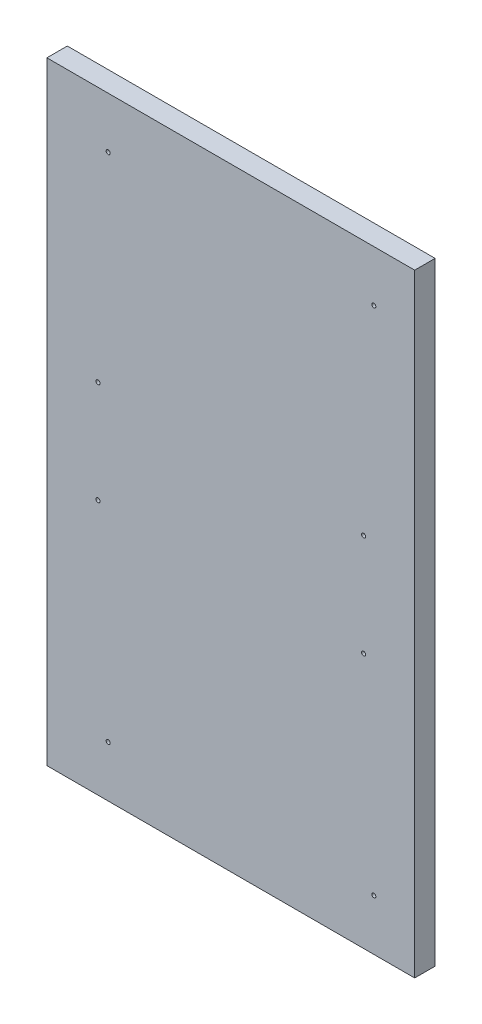
ISO-10303-21;
HEADER;
FILE_DESCRIPTION(('STEP AP214'),'2;1');
FILE_NAME('part.step','',(''),(''),'','','');
FILE_SCHEMA(('AUTOMOTIVE_DESIGN { 1 0 10303 214 1 1 1 1 }'));
ENDSEC;
DATA;
#1=APPLICATION_CONTEXT('core data for automotive mechanical design processes');
#2=APPLICATION_PROTOCOL_DEFINITION('international standard','automotive_design',2000,#1);
#3=PRODUCT_CONTEXT('',#1,'mechanical');
#4=PRODUCT('Part','Part','',(#3));
#5=PRODUCT_RELATED_PRODUCT_CATEGORY('part','',(#4));
#6=PRODUCT_DEFINITION_FORMATION('','',#4);
#7=PRODUCT_DEFINITION_CONTEXT('part definition',#1,'design');
#8=PRODUCT_DEFINITION('design','',#6,#7);
#9=PRODUCT_DEFINITION_SHAPE('','',#8);
#10=(LENGTH_UNIT() NAMED_UNIT(*) SI_UNIT(.MILLI.,.METRE.));
#11=(NAMED_UNIT(*) PLANE_ANGLE_UNIT() SI_UNIT($,.RADIAN.));
#12=(NAMED_UNIT(*) SI_UNIT($,.STERADIAN.) SOLID_ANGLE_UNIT());
#13=UNCERTAINTY_MEASURE_WITH_UNIT(LENGTH_MEASURE(1.E-05),#10,'distance_accuracy_value','');
#14=(GEOMETRIC_REPRESENTATION_CONTEXT(3) GLOBAL_UNCERTAINTY_ASSIGNED_CONTEXT((#13)) GLOBAL_UNIT_ASSIGNED_CONTEXT((#10,
#11,#12)) REPRESENTATION_CONTEXT('',''));
#15=CARTESIAN_POINT('',(0.,0.,0.));
#16=DIRECTION('',(0.,0.,1.));
#17=DIRECTION('',(1.,0.,0.));
#18=AXIS2_PLACEMENT_3D('',#15,#16,#17);
#19=CARTESIAN_POINT('',(90.,150.,10.));
#20=DIRECTION('',(-1.,0.,0.));
#21=DIRECTION('',(0.,-1.,0.));
#22=AXIS2_PLACEMENT_3D('',#19,#20,#21);
#23=PLANE('',#22);
#24=DIRECTION('',(0.,1.,0.));
#25=VECTOR('',#24,1.);
#26=CARTESIAN_POINT('',(90.,150.,0.));
#27=LINE('',#26,#25);
#28=CARTESIAN_POINT('',(90.,-150.,0.));
#29=VERTEX_POINT('',#28);
#30=CARTESIAN_POINT('',(90.,150.,0.));
#31=VERTEX_POINT('',#30);
#32=EDGE_CURVE('E280',#29,#31,#27,.T.);
#33=ORIENTED_EDGE('',*,*,#32,.T.);
#34=DIRECTION('',(0.,0.,-1.));
#35=VECTOR('',#34,1.);
#36=CARTESIAN_POINT('',(90.,150.,10.));
#37=LINE('',#36,#35);
#38=CARTESIAN_POINT('',(90.,150.,10.));
#39=VERTEX_POINT('',#38);
#40=EDGE_CURVE('E11',#39,#31,#37,.T.);
#41=ORIENTED_EDGE('',*,*,#40,.F.);
#42=DIRECTION('',(0.,1.,0.));
#43=VECTOR('',#42,1.);
#44=CARTESIAN_POINT('',(90.,150.,10.));
#45=LINE('',#44,#43);
#46=CARTESIAN_POINT('',(90.,-150.,10.));
#47=VERTEX_POINT('',#46);
#48=EDGE_CURVE('E281',#47,#39,#45,.T.);
#49=ORIENTED_EDGE('',*,*,#48,.F.);
#50=DIRECTION('',(0.,0.,-1.));
#51=VECTOR('',#50,1.);
#52=CARTESIAN_POINT('',(90.,-150.,10.));
#53=LINE('',#52,#51);
#54=EDGE_CURVE('E291',#47,#29,#53,.T.);
#55=ORIENTED_EDGE('',*,*,#54,.T.);
#56=EDGE_LOOP('',(#33,#41,#49,#55));
#57=FACE_BOUND('',#56,.T.);
#58=ADVANCED_FACE('F46',(#57),#23,.F.);
#59=CARTESIAN_POINT('',(-90.,150.,10.));
#60=DIRECTION('',(0.,-1.,0.));
#61=DIRECTION('',(0.,0.,-1.));
#62=AXIS2_PLACEMENT_3D('',#59,#60,#61);
#63=PLANE('',#62);
#64=DIRECTION('',(-1.,0.,0.));
#65=VECTOR('',#64,1.);
#66=CARTESIAN_POINT('',(-90.,150.,0.));
#67=LINE('',#66,#65);
#68=CARTESIAN_POINT('',(-90.,150.,0.));
#69=VERTEX_POINT('',#68);
#70=EDGE_CURVE('E295',#31,#69,#67,.T.);
#71=ORIENTED_EDGE('',*,*,#70,.T.);
#72=DIRECTION('',(0.,0.,-1.));
#73=VECTOR('',#72,1.);
#74=CARTESIAN_POINT('',(-90.,150.,10.));
#75=LINE('',#74,#73);
#76=CARTESIAN_POINT('',(-90.,150.,10.));
#77=VERTEX_POINT('',#76);
#78=EDGE_CURVE('E55',#77,#69,#75,.T.);
#79=ORIENTED_EDGE('',*,*,#78,.F.);
#80=DIRECTION('',(-1.,0.,0.));
#81=VECTOR('',#80,1.);
#82=CARTESIAN_POINT('',(-90.,150.,10.));
#83=LINE('',#82,#81);
#84=EDGE_CURVE('E94',#39,#77,#83,.T.);
#85=ORIENTED_EDGE('',*,*,#84,.F.);
#86=ORIENTED_EDGE('',*,*,#40,.T.);
#87=EDGE_LOOP('',(#71,#79,#85,#86));
#88=FACE_BOUND('',#87,.T.);
#89=ADVANCED_FACE('F325',(#88),#63,.F.);
#90=CARTESIAN_POINT('',(-90.,150.,10.));
#91=DIRECTION('',(1.,0.,0.));
#92=DIRECTION('',(0.,1.,0.));
#93=AXIS2_PLACEMENT_3D('',#90,#91,#92);
#94=PLANE('',#93);
#95=DIRECTION('',(0.,-1.,0.));
#96=VECTOR('',#95,1.);
#97=CARTESIAN_POINT('',(-90.,150.,0.));
#98=LINE('',#97,#96);
#99=CARTESIAN_POINT('',(-90.,-150.,0.));
#100=VERTEX_POINT('',#99);
#101=EDGE_CURVE('E81',#69,#100,#98,.T.);
#102=ORIENTED_EDGE('',*,*,#101,.T.);
#103=DIRECTION('',(0.,0.,-1.));
#104=VECTOR('',#103,1.);
#105=CARTESIAN_POINT('',(-90.,-150.,10.));
#106=LINE('',#105,#104);
#107=CARTESIAN_POINT('',(-90.,-150.,10.));
#108=VERTEX_POINT('',#107);
#109=EDGE_CURVE('E304',#108,#100,#106,.T.);
#110=ORIENTED_EDGE('',*,*,#109,.F.);
#111=DIRECTION('',(0.,-1.,0.));
#112=VECTOR('',#111,1.);
#113=CARTESIAN_POINT('',(-90.,150.,10.));
#114=LINE('',#113,#112);
#115=EDGE_CURVE('E286',#77,#108,#114,.T.);
#116=ORIENTED_EDGE('',*,*,#115,.F.);
#117=ORIENTED_EDGE('',*,*,#78,.T.);
#118=EDGE_LOOP('',(#102,#110,#116,#117));
#119=FACE_BOUND('',#118,.T.);
#120=ADVANCED_FACE('F308',(#119),#94,.F.);
#121=CARTESIAN_POINT('',(-90.,-150.,10.));
#122=DIRECTION('',(0.,1.,0.));
#123=DIRECTION('',(0.,0.,1.));
#124=AXIS2_PLACEMENT_3D('',#121,#122,#123);
#125=PLANE('',#124);
#126=DIRECTION('',(1.,0.,0.));
#127=VECTOR('',#126,1.);
#128=CARTESIAN_POINT('',(-90.,-150.,0.));
#129=LINE('',#128,#127);
#130=EDGE_CURVE('E87',#100,#29,#129,.T.);
#131=ORIENTED_EDGE('',*,*,#130,.T.);
#132=ORIENTED_EDGE('',*,*,#54,.F.);
#133=DIRECTION('',(1.,0.,0.));
#134=VECTOR('',#133,1.);
#135=CARTESIAN_POINT('',(-90.,-150.,10.));
#136=LINE('',#135,#134);
#137=EDGE_CURVE('E63',#108,#47,#136,.T.);
#138=ORIENTED_EDGE('',*,*,#137,.F.);
#139=ORIENTED_EDGE('',*,*,#109,.T.);
#140=EDGE_LOOP('',(#131,#132,#138,#139));
#141=FACE_BOUND('',#140,.T.);
#142=ADVANCED_FACE('F315',(#141),#125,.F.);
#143=CARTESIAN_POINT('',(0.,0.,10.));
#144=DIRECTION('',(0.,0.,1.));
#145=DIRECTION('',(1.,0.,0.));
#146=AXIS2_PLACEMENT_3D('',#143,#144,#145);
#147=PLANE('',#146);
#148=CARTESIAN_POINT('',(-65.,25.,10.));
#149=DIRECTION('',(0.,0.,1.));
#150=DIRECTION('',(1.,0.,0.));
#151=AXIS2_PLACEMENT_3D('',#148,#149,#150);
#152=CIRCLE('',#151,0.999999999999987);
#153=CARTESIAN_POINT('',(-64.,25.,10.));
#154=VERTEX_POINT('',#153);
#155=EDGE_CURVE('E184',#154,#154,#152,.T.);
#156=ORIENTED_EDGE('',*,*,#155,.F.);
#157=EDGE_LOOP('',(#156));
#158=FACE_BOUND('',#157,.T.);
#159=CARTESIAN_POINT('',(65.,25.,10.));
#160=DIRECTION('',(0.,0.,1.));
#161=DIRECTION('',(1.,0.,0.));
#162=AXIS2_PLACEMENT_3D('',#159,#160,#161);
#163=CIRCLE('',#162,0.999999999999987);
#164=CARTESIAN_POINT('',(66.,25.,10.));
#165=VERTEX_POINT('',#164);
#166=EDGE_CURVE('E192',#165,#165,#163,.T.);
#167=ORIENTED_EDGE('',*,*,#166,.F.);
#168=EDGE_LOOP('',(#167));
#169=FACE_BOUND('',#168,.T.);
#170=CARTESIAN_POINT('',(65.,-25.,10.));
#171=DIRECTION('',(0.,0.,1.));
#172=DIRECTION('',(1.,0.,0.));
#173=AXIS2_PLACEMENT_3D('',#170,#171,#172);
#174=CIRCLE('',#173,0.999999999999987);
#175=CARTESIAN_POINT('',(66.,-25.,10.));
#176=VERTEX_POINT('',#175);
#177=EDGE_CURVE('E200',#176,#176,#174,.T.);
#178=ORIENTED_EDGE('',*,*,#177,.F.);
#179=EDGE_LOOP('',(#178));
#180=FACE_BOUND('',#179,.T.);
#181=CARTESIAN_POINT('',(-65.,-25.,10.));
#182=DIRECTION('',(0.,0.,1.));
#183=DIRECTION('',(1.,0.,0.));
#184=AXIS2_PLACEMENT_3D('',#181,#182,#183);
#185=CIRCLE('',#184,0.999999999999987);
#186=CARTESIAN_POINT('',(-64.,-25.,10.));
#187=VERTEX_POINT('',#186);
#188=EDGE_CURVE('E208',#187,#187,#185,.T.);
#189=ORIENTED_EDGE('',*,*,#188,.F.);
#190=EDGE_LOOP('',(#189));
#191=FACE_BOUND('',#190,.T.);
#192=CARTESIAN_POINT('',(-60.,125.,10.));
#193=DIRECTION('',(0.,0.,1.));
#194=DIRECTION('',(1.,0.,0.));
#195=AXIS2_PLACEMENT_3D('',#192,#193,#194);
#196=CIRCLE('',#195,0.999999999999987);
#197=CARTESIAN_POINT('',(-59.,125.,10.));
#198=VERTEX_POINT('',#197);
#199=EDGE_CURVE('E216',#198,#198,#196,.T.);
#200=ORIENTED_EDGE('',*,*,#199,.F.);
#201=EDGE_LOOP('',(#200));
#202=FACE_BOUND('',#201,.T.);
#203=CARTESIAN_POINT('',(70.,125.,10.));
#204=DIRECTION('',(0.,0.,1.));
#205=DIRECTION('',(1.,0.,0.));
#206=AXIS2_PLACEMENT_3D('',#203,#204,#205);
#207=CIRCLE('',#206,0.999999999999987);
#208=CARTESIAN_POINT('',(71.,125.,10.));
#209=VERTEX_POINT('',#208);
#210=EDGE_CURVE('E224',#209,#209,#207,.T.);
#211=ORIENTED_EDGE('',*,*,#210,.F.);
#212=EDGE_LOOP('',(#211));
#213=FACE_BOUND('',#212,.T.);
#214=CARTESIAN_POINT('',(70.,-125.,10.));
#215=DIRECTION('',(0.,0.,1.));
#216=DIRECTION('',(1.,0.,0.));
#217=AXIS2_PLACEMENT_3D('',#214,#215,#216);
#218=CIRCLE('',#217,0.999999999999987);
#219=CARTESIAN_POINT('',(71.,-125.,10.));
#220=VERTEX_POINT('',#219);
#221=EDGE_CURVE('E232',#220,#220,#218,.T.);
#222=ORIENTED_EDGE('',*,*,#221,.F.);
#223=EDGE_LOOP('',(#222));
#224=FACE_BOUND('',#223,.T.);
#225=CARTESIAN_POINT('',(-60.,-125.,10.));
#226=DIRECTION('',(0.,0.,1.));
#227=DIRECTION('',(1.,0.,0.));
#228=AXIS2_PLACEMENT_3D('',#225,#226,#227);
#229=CIRCLE('',#228,0.999999999999987);
#230=CARTESIAN_POINT('',(-59.,-125.,10.));
#231=VERTEX_POINT('',#230);
#232=EDGE_CURVE('E240',#231,#231,#229,.T.);
#233=ORIENTED_EDGE('',*,*,#232,.F.);
#234=EDGE_LOOP('',(#233));
#235=FACE_BOUND('',#234,.T.);
#236=ORIENTED_EDGE('',*,*,#48,.T.);
#237=ORIENTED_EDGE('',*,*,#84,.T.);
#238=ORIENTED_EDGE('',*,*,#115,.T.);
#239=ORIENTED_EDGE('',*,*,#137,.T.);
#240=EDGE_LOOP('',(#236,#237,#238,#239));
#241=FACE_BOUND('',#240,.T.);
#242=ADVANCED_FACE('F317',(#158,#169,#180,#191,#202,#213,#224,#235,#241),#147,.T.);
#243=CARTESIAN_POINT('',(0.,0.,0.));
#244=DIRECTION('',(0.,0.,1.));
#245=DIRECTION('',(1.,0.,0.));
#246=AXIS2_PLACEMENT_3D('',#243,#244,#245);
#247=PLANE('',#246);
#248=CARTESIAN_POINT('',(0.,140.,0.));
#249=DIRECTION('',(0.,0.,-1.));
#250=DIRECTION('',(-1.,0.,0.));
#251=AXIS2_PLACEMENT_3D('',#248,#249,#250);
#252=CIRCLE('',#251,0.999999999999989);
#253=CARTESIAN_POINT('',(-0.999999999999989,140.,0.));
#254=VERTEX_POINT('',#253);
#255=EDGE_CURVE('E155',#254,#254,#252,.T.);
#256=ORIENTED_EDGE('',*,*,#255,.F.);
#257=EDGE_LOOP('',(#256));
#258=FACE_BOUND('',#257,.T.);
#259=CARTESIAN_POINT('',(0.,122.8,0.));
#260=DIRECTION('',(0.,0.,-1.));
#261=DIRECTION('',(-1.,0.,0.));
#262=AXIS2_PLACEMENT_3D('',#259,#260,#261);
#263=CIRCLE('',#262,0.999999999999989);
#264=CARTESIAN_POINT('',(-0.999999999999989,122.8,0.));
#265=VERTEX_POINT('',#264);
#266=EDGE_CURVE('E154',#265,#265,#263,.T.);
#267=ORIENTED_EDGE('',*,*,#266,.F.);
#268=EDGE_LOOP('',(#267));
#269=FACE_BOUND('',#268,.T.);
#270=CARTESIAN_POINT('',(0.,-122.8,0.));
#271=DIRECTION('',(0.,0.,-1.));
#272=DIRECTION('',(-1.,0.,0.));
#273=AXIS2_PLACEMENT_3D('',#270,#271,#272);
#274=CIRCLE('',#273,0.999999999999989);
#275=CARTESIAN_POINT('',(-0.999999999999989,-122.8,0.));
#276=VERTEX_POINT('',#275);
#277=EDGE_CURVE('E168',#276,#276,#274,.T.);
#278=ORIENTED_EDGE('',*,*,#277,.F.);
#279=EDGE_LOOP('',(#278));
#280=FACE_BOUND('',#279,.T.);
#281=CARTESIAN_POINT('',(0.,-140.,0.));
#282=DIRECTION('',(0.,0.,-1.));
#283=DIRECTION('',(-1.,0.,0.));
#284=AXIS2_PLACEMENT_3D('',#281,#282,#283);
#285=CIRCLE('',#284,0.999999999999989);
#286=CARTESIAN_POINT('',(-0.999999999999989,-140.,0.));
#287=VERTEX_POINT('',#286);
#288=EDGE_CURVE('E176',#287,#287,#285,.T.);
#289=ORIENTED_EDGE('',*,*,#288,.F.);
#290=EDGE_LOOP('',(#289));
#291=FACE_BOUND('',#290,.T.);
#292=CARTESIAN_POINT('',(50.,-110.,0.));
#293=DIRECTION('',(0.,0.,-1.));
#294=DIRECTION('',(-1.,0.,0.));
#295=AXIS2_PLACEMENT_3D('',#292,#293,#294);
#296=CIRCLE('',#295,0.999999999999987);
#297=CARTESIAN_POINT('',(49.,-110.,0.));
#298=VERTEX_POINT('',#297);
#299=EDGE_CURVE('E248',#298,#298,#296,.T.);
#300=ORIENTED_EDGE('',*,*,#299,.F.);
#301=EDGE_LOOP('',(#300));
#302=FACE_BOUND('',#301,.T.);
#303=CARTESIAN_POINT('',(49.9999999999999,110.,0.));
#304=DIRECTION('',(0.,0.,-1.));
#305=DIRECTION('',(-1.,0.,0.));
#306=AXIS2_PLACEMENT_3D('',#303,#304,#305);
#307=CIRCLE('',#306,0.999999999999987);
#308=CARTESIAN_POINT('',(48.9999999999999,110.,0.));
#309=VERTEX_POINT('',#308);
#310=EDGE_CURVE('E256',#309,#309,#307,.T.);
#311=ORIENTED_EDGE('',*,*,#310,.F.);
#312=EDGE_LOOP('',(#311));
#313=FACE_BOUND('',#312,.T.);
#314=CARTESIAN_POINT('',(-50.,110.,0.));
#315=DIRECTION('',(0.,0.,-1.));
#316=DIRECTION('',(-1.,0.,0.));
#317=AXIS2_PLACEMENT_3D('',#314,#315,#316);
#318=CIRCLE('',#317,0.999999999999987);
#319=CARTESIAN_POINT('',(-51.,110.,0.));
#320=VERTEX_POINT('',#319);
#321=EDGE_CURVE('E264',#320,#320,#318,.T.);
#322=ORIENTED_EDGE('',*,*,#321,.F.);
#323=EDGE_LOOP('',(#322));
#324=FACE_BOUND('',#323,.T.);
#325=CARTESIAN_POINT('',(-50.,-110.,0.));
#326=DIRECTION('',(0.,0.,-1.));
#327=DIRECTION('',(-1.,0.,0.));
#328=AXIS2_PLACEMENT_3D('',#325,#326,#327);
#329=CIRCLE('',#328,0.999999999999987);
#330=CARTESIAN_POINT('',(-51.,-110.,0.));
#331=VERTEX_POINT('',#330);
#332=EDGE_CURVE('E272',#331,#331,#329,.T.);
#333=ORIENTED_EDGE('',*,*,#332,.F.);
#334=EDGE_LOOP('',(#333));
#335=FACE_BOUND('',#334,.T.);
#336=ORIENTED_EDGE('',*,*,#32,.F.);
#337=ORIENTED_EDGE('',*,*,#130,.F.);
#338=ORIENTED_EDGE('',*,*,#101,.F.);
#339=ORIENTED_EDGE('',*,*,#70,.F.);
#340=EDGE_LOOP('',(#336,#337,#338,#339));
#341=FACE_BOUND('',#340,.T.);
#342=ADVANCED_FACE('F311',(#258,#269,#280,#291,#302,#313,#324,#335,#341),#247,.F.);
#343=CARTESIAN_POINT('',(-50.,-110.,6.39913938097244));
#344=DIRECTION('',(0.,0.,-1.));
#345=DIRECTION('',(-1.,0.,0.));
#346=AXIS2_PLACEMENT_3D('',#343,#344,#345);
#347=CONICAL_SURFACE('',#346,1.,1.02974425867665);
#348=CARTESIAN_POINT('',(-50.,-110.,7.));
#349=VERTEX_POINT('',#348);
#350=VERTEX_LOOP('',#349);
#351=FACE_BOUND('',#350,.T.);
#352=CARTESIAN_POINT('',(-50.,-110.,6.39913938097244));
#353=DIRECTION('',(0.,0.,-1.));
#354=DIRECTION('',(-1.,0.,0.));
#355=AXIS2_PLACEMENT_3D('',#352,#353,#354);
#356=CIRCLE('',#355,1.);
#357=CARTESIAN_POINT('',(-51.,-110.,6.39913938097244));
#358=VERTEX_POINT('',#357);
#359=EDGE_CURVE('E276',#358,#358,#356,.T.);
#360=ORIENTED_EDGE('',*,*,#359,.T.);
#361=EDGE_LOOP('',(#360));
#362=FACE_BOUND('',#361,.T.);
#363=ADVANCED_FACE('F350',(#351,#362),#347,.F.);
#364=CARTESIAN_POINT('',(-50.,-110.,0.));
#365=DIRECTION('',(0.,0.,-1.));
#366=DIRECTION('',(-1.,0.,0.));
#367=AXIS2_PLACEMENT_3D('',#364,#365,#366);
#368=CYLINDRICAL_SURFACE('',#367,0.999999999999994);
#369=ORIENTED_EDGE('',*,*,#359,.F.);
#370=EDGE_LOOP('',(#369));
#371=FACE_BOUND('',#370,.T.);
#372=ORIENTED_EDGE('',*,*,#332,.T.);
#373=EDGE_LOOP('',(#372));
#374=FACE_BOUND('',#373,.T.);
#375=ADVANCED_FACE('F355',(#371,#374),#368,.F.);
#376=CARTESIAN_POINT('',(-50.,110.,6.39913938097244));
#377=DIRECTION('',(0.,0.,-1.));
#378=DIRECTION('',(-1.,0.,0.));
#379=AXIS2_PLACEMENT_3D('',#376,#377,#378);
#380=CONICAL_SURFACE('',#379,1.,1.02974425867665);
#381=CARTESIAN_POINT('',(-50.,110.,7.));
#382=VERTEX_POINT('',#381);
#383=VERTEX_LOOP('',#382);
#384=FACE_BOUND('',#383,.T.);
#385=CARTESIAN_POINT('',(-50.,110.,6.39913938097244));
#386=DIRECTION('',(0.,0.,-1.));
#387=DIRECTION('',(-1.,0.,0.));
#388=AXIS2_PLACEMENT_3D('',#385,#386,#387);
#389=CIRCLE('',#388,1.);
#390=CARTESIAN_POINT('',(-51.,110.,6.39913938097244));
#391=VERTEX_POINT('',#390);
#392=EDGE_CURVE('E268',#391,#391,#389,.T.);
#393=ORIENTED_EDGE('',*,*,#392,.T.);
#394=EDGE_LOOP('',(#393));
#395=FACE_BOUND('',#394,.T.);
#396=ADVANCED_FACE('F368',(#384,#395),#380,.F.);
#397=CARTESIAN_POINT('',(-50.,110.,0.));
#398=DIRECTION('',(0.,0.,-1.));
#399=DIRECTION('',(-1.,0.,0.));
#400=AXIS2_PLACEMENT_3D('',#397,#398,#399);
#401=CYLINDRICAL_SURFACE('',#400,0.999999999999994);
#402=ORIENTED_EDGE('',*,*,#392,.F.);
#403=EDGE_LOOP('',(#402));
#404=FACE_BOUND('',#403,.T.);
#405=ORIENTED_EDGE('',*,*,#321,.T.);
#406=EDGE_LOOP('',(#405));
#407=FACE_BOUND('',#406,.T.);
#408=ADVANCED_FACE('F379',(#404,#407),#401,.F.);
#409=CARTESIAN_POINT('',(49.9999999999999,110.,6.39913938097244));
#410=DIRECTION('',(0.,0.,-1.));
#411=DIRECTION('',(-1.,0.,0.));
#412=AXIS2_PLACEMENT_3D('',#409,#410,#411);
#413=CONICAL_SURFACE('',#412,1.,1.02974425867665);
#414=CARTESIAN_POINT('',(49.9999999999999,110.,7.));
#415=VERTEX_POINT('',#414);
#416=VERTEX_LOOP('',#415);
#417=FACE_BOUND('',#416,.T.);
#418=CARTESIAN_POINT('',(49.9999999999999,110.,6.39913938097244));
#419=DIRECTION('',(0.,0.,-1.));
#420=DIRECTION('',(-1.,0.,0.));
#421=AXIS2_PLACEMENT_3D('',#418,#419,#420);
#422=CIRCLE('',#421,1.);
#423=CARTESIAN_POINT('',(48.9999999999999,110.,6.39913938097244));
#424=VERTEX_POINT('',#423);
#425=EDGE_CURVE('E260',#424,#424,#422,.T.);
#426=ORIENTED_EDGE('',*,*,#425,.T.);
#427=EDGE_LOOP('',(#426));
#428=FACE_BOUND('',#427,.T.);
#429=ADVANCED_FACE('F390',(#417,#428),#413,.F.);
#430=CARTESIAN_POINT('',(49.9999999999999,110.,0.));
#431=DIRECTION('',(0.,0.,-1.));
#432=DIRECTION('',(-1.,0.,0.));
#433=AXIS2_PLACEMENT_3D('',#430,#431,#432);
#434=CYLINDRICAL_SURFACE('',#433,0.999999999999994);
#435=ORIENTED_EDGE('',*,*,#425,.F.);
#436=EDGE_LOOP('',(#435));
#437=FACE_BOUND('',#436,.T.);
#438=ORIENTED_EDGE('',*,*,#310,.T.);
#439=EDGE_LOOP('',(#438));
#440=FACE_BOUND('',#439,.T.);
#441=ADVANCED_FACE('F401',(#437,#440),#434,.F.);
#442=CARTESIAN_POINT('',(50.,-110.,6.39913938097244));
#443=DIRECTION('',(0.,0.,-1.));
#444=DIRECTION('',(-1.,0.,0.));
#445=AXIS2_PLACEMENT_3D('',#442,#443,#444);
#446=CONICAL_SURFACE('',#445,1.,1.02974425867665);
#447=CARTESIAN_POINT('',(50.,-110.,7.));
#448=VERTEX_POINT('',#447);
#449=VERTEX_LOOP('',#448);
#450=FACE_BOUND('',#449,.T.);
#451=CARTESIAN_POINT('',(50.,-110.,6.39913938097244));
#452=DIRECTION('',(0.,0.,-1.));
#453=DIRECTION('',(-1.,0.,0.));
#454=AXIS2_PLACEMENT_3D('',#451,#452,#453);
#455=CIRCLE('',#454,1.);
#456=CARTESIAN_POINT('',(49.,-110.,6.39913938097244));
#457=VERTEX_POINT('',#456);
#458=EDGE_CURVE('E252',#457,#457,#455,.T.);
#459=ORIENTED_EDGE('',*,*,#458,.T.);
#460=EDGE_LOOP('',(#459));
#461=FACE_BOUND('',#460,.T.);
#462=ADVANCED_FACE('F412',(#450,#461),#446,.F.);
#463=CARTESIAN_POINT('',(50.,-110.,0.));
#464=DIRECTION('',(0.,0.,-1.));
#465=DIRECTION('',(-1.,0.,0.));
#466=AXIS2_PLACEMENT_3D('',#463,#464,#465);
#467=CYLINDRICAL_SURFACE('',#466,0.999999999999994);
#468=ORIENTED_EDGE('',*,*,#458,.F.);
#469=EDGE_LOOP('',(#468));
#470=FACE_BOUND('',#469,.T.);
#471=ORIENTED_EDGE('',*,*,#299,.T.);
#472=EDGE_LOOP('',(#471));
#473=FACE_BOUND('',#472,.T.);
#474=ADVANCED_FACE('F423',(#470,#473),#467,.F.);
#475=CARTESIAN_POINT('',(-60.,-125.,3.60086061902756));
#476=DIRECTION('',(0.,0.,1.));
#477=DIRECTION('',(1.,0.,0.));
#478=AXIS2_PLACEMENT_3D('',#475,#476,#477);
#479=CONICAL_SURFACE('',#478,1.,1.02974425867665);
#480=CARTESIAN_POINT('',(-60.,-125.,3.));
#481=VERTEX_POINT('',#480);
#482=VERTEX_LOOP('',#481);
#483=FACE_BOUND('',#482,.T.);
#484=CARTESIAN_POINT('',(-60.,-125.,3.60086061902756));
#485=DIRECTION('',(0.,0.,1.));
#486=DIRECTION('',(1.,0.,0.));
#487=AXIS2_PLACEMENT_3D('',#484,#485,#486);
#488=CIRCLE('',#487,1.);
#489=CARTESIAN_POINT('',(-59.,-125.,3.60086061902756));
#490=VERTEX_POINT('',#489);
#491=EDGE_CURVE('E244',#490,#490,#488,.T.);
#492=ORIENTED_EDGE('',*,*,#491,.T.);
#493=EDGE_LOOP('',(#492));
#494=FACE_BOUND('',#493,.T.);
#495=ADVANCED_FACE('F434',(#483,#494),#479,.F.);
#496=CARTESIAN_POINT('',(-60.,-125.,10.));
#497=DIRECTION('',(0.,0.,1.));
#498=DIRECTION('',(1.,0.,0.));
#499=AXIS2_PLACEMENT_3D('',#496,#497,#498);
#500=CYLINDRICAL_SURFACE('',#499,0.999999999999994);
#501=ORIENTED_EDGE('',*,*,#491,.F.);
#502=EDGE_LOOP('',(#501));
#503=FACE_BOUND('',#502,.T.);
#504=ORIENTED_EDGE('',*,*,#232,.T.);
#505=EDGE_LOOP('',(#504));
#506=FACE_BOUND('',#505,.T.);
#507=ADVANCED_FACE('F445',(#503,#506),#500,.F.);
#508=CARTESIAN_POINT('',(70.,-125.,3.60086061902756));
#509=DIRECTION('',(0.,0.,1.));
#510=DIRECTION('',(1.,0.,0.));
#511=AXIS2_PLACEMENT_3D('',#508,#509,#510);
#512=CONICAL_SURFACE('',#511,1.,1.02974425867665);
#513=CARTESIAN_POINT('',(70.,-125.,3.));
#514=VERTEX_POINT('',#513);
#515=VERTEX_LOOP('',#514);
#516=FACE_BOUND('',#515,.T.);
#517=CARTESIAN_POINT('',(70.,-125.,3.60086061902756));
#518=DIRECTION('',(0.,0.,1.));
#519=DIRECTION('',(1.,0.,0.));
#520=AXIS2_PLACEMENT_3D('',#517,#518,#519);
#521=CIRCLE('',#520,1.);
#522=CARTESIAN_POINT('',(71.,-125.,3.60086061902756));
#523=VERTEX_POINT('',#522);
#524=EDGE_CURVE('E236',#523,#523,#521,.T.);
#525=ORIENTED_EDGE('',*,*,#524,.T.);
#526=EDGE_LOOP('',(#525));
#527=FACE_BOUND('',#526,.T.);
#528=ADVANCED_FACE('F456',(#516,#527),#512,.F.);
#529=CARTESIAN_POINT('',(70.,-125.,10.));
#530=DIRECTION('',(0.,0.,1.));
#531=DIRECTION('',(1.,0.,0.));
#532=AXIS2_PLACEMENT_3D('',#529,#530,#531);
#533=CYLINDRICAL_SURFACE('',#532,0.999999999999994);
#534=ORIENTED_EDGE('',*,*,#524,.F.);
#535=EDGE_LOOP('',(#534));
#536=FACE_BOUND('',#535,.T.);
#537=ORIENTED_EDGE('',*,*,#221,.T.);
#538=EDGE_LOOP('',(#537));
#539=FACE_BOUND('',#538,.T.);
#540=ADVANCED_FACE('F467',(#536,#539),#533,.F.);
#541=CARTESIAN_POINT('',(70.,125.,3.60086061902756));
#542=DIRECTION('',(0.,0.,1.));
#543=DIRECTION('',(1.,0.,0.));
#544=AXIS2_PLACEMENT_3D('',#541,#542,#543);
#545=CONICAL_SURFACE('',#544,1.,1.02974425867665);
#546=CARTESIAN_POINT('',(70.,125.,3.));
#547=VERTEX_POINT('',#546);
#548=VERTEX_LOOP('',#547);
#549=FACE_BOUND('',#548,.T.);
#550=CARTESIAN_POINT('',(70.,125.,3.60086061902756));
#551=DIRECTION('',(0.,0.,1.));
#552=DIRECTION('',(1.,0.,0.));
#553=AXIS2_PLACEMENT_3D('',#550,#551,#552);
#554=CIRCLE('',#553,1.);
#555=CARTESIAN_POINT('',(71.,125.,3.60086061902756));
#556=VERTEX_POINT('',#555);
#557=EDGE_CURVE('E228',#556,#556,#554,.T.);
#558=ORIENTED_EDGE('',*,*,#557,.T.);
#559=EDGE_LOOP('',(#558));
#560=FACE_BOUND('',#559,.T.);
#561=ADVANCED_FACE('F478',(#549,#560),#545,.F.);
#562=CARTESIAN_POINT('',(70.,125.,10.));
#563=DIRECTION('',(0.,0.,1.));
#564=DIRECTION('',(1.,0.,0.));
#565=AXIS2_PLACEMENT_3D('',#562,#563,#564);
#566=CYLINDRICAL_SURFACE('',#565,0.999999999999994);
#567=ORIENTED_EDGE('',*,*,#557,.F.);
#568=EDGE_LOOP('',(#567));
#569=FACE_BOUND('',#568,.T.);
#570=ORIENTED_EDGE('',*,*,#210,.T.);
#571=EDGE_LOOP('',(#570));
#572=FACE_BOUND('',#571,.T.);
#573=ADVANCED_FACE('F489',(#569,#572),#566,.F.);
#574=CARTESIAN_POINT('',(-60.,125.,3.60086061902756));
#575=DIRECTION('',(0.,0.,1.));
#576=DIRECTION('',(1.,0.,0.));
#577=AXIS2_PLACEMENT_3D('',#574,#575,#576);
#578=CONICAL_SURFACE('',#577,1.,1.02974425867665);
#579=CARTESIAN_POINT('',(-60.,125.,3.));
#580=VERTEX_POINT('',#579);
#581=VERTEX_LOOP('',#580);
#582=FACE_BOUND('',#581,.T.);
#583=CARTESIAN_POINT('',(-60.,125.,3.60086061902756));
#584=DIRECTION('',(0.,0.,1.));
#585=DIRECTION('',(1.,0.,0.));
#586=AXIS2_PLACEMENT_3D('',#583,#584,#585);
#587=CIRCLE('',#586,1.);
#588=CARTESIAN_POINT('',(-59.,125.,3.60086061902756));
#589=VERTEX_POINT('',#588);
#590=EDGE_CURVE('E220',#589,#589,#587,.T.);
#591=ORIENTED_EDGE('',*,*,#590,.T.);
#592=EDGE_LOOP('',(#591));
#593=FACE_BOUND('',#592,.T.);
#594=ADVANCED_FACE('F500',(#582,#593),#578,.F.);
#595=CARTESIAN_POINT('',(-60.,125.,10.));
#596=DIRECTION('',(0.,0.,1.));
#597=DIRECTION('',(1.,0.,0.));
#598=AXIS2_PLACEMENT_3D('',#595,#596,#597);
#599=CYLINDRICAL_SURFACE('',#598,0.999999999999994);
#600=ORIENTED_EDGE('',*,*,#590,.F.);
#601=EDGE_LOOP('',(#600));
#602=FACE_BOUND('',#601,.T.);
#603=ORIENTED_EDGE('',*,*,#199,.T.);
#604=EDGE_LOOP('',(#603));
#605=FACE_BOUND('',#604,.T.);
#606=ADVANCED_FACE('F511',(#602,#605),#599,.F.);
#607=CARTESIAN_POINT('',(-65.,-25.,3.60086061902756));
#608=DIRECTION('',(0.,0.,1.));
#609=DIRECTION('',(1.,0.,0.));
#610=AXIS2_PLACEMENT_3D('',#607,#608,#609);
#611=CONICAL_SURFACE('',#610,1.,1.02974425867665);
#612=CARTESIAN_POINT('',(-65.,-25.,3.));
#613=VERTEX_POINT('',#612);
#614=VERTEX_LOOP('',#613);
#615=FACE_BOUND('',#614,.T.);
#616=CARTESIAN_POINT('',(-65.,-25.,3.60086061902756));
#617=DIRECTION('',(0.,0.,1.));
#618=DIRECTION('',(1.,0.,0.));
#619=AXIS2_PLACEMENT_3D('',#616,#617,#618);
#620=CIRCLE('',#619,1.);
#621=CARTESIAN_POINT('',(-64.,-25.,3.60086061902756));
#622=VERTEX_POINT('',#621);
#623=EDGE_CURVE('E212',#622,#622,#620,.T.);
#624=ORIENTED_EDGE('',*,*,#623,.T.);
#625=EDGE_LOOP('',(#624));
#626=FACE_BOUND('',#625,.T.);
#627=ADVANCED_FACE('F522',(#615,#626),#611,.F.);
#628=CARTESIAN_POINT('',(-65.,-25.,10.));
#629=DIRECTION('',(0.,0.,1.));
#630=DIRECTION('',(1.,0.,0.));
#631=AXIS2_PLACEMENT_3D('',#628,#629,#630);
#632=CYLINDRICAL_SURFACE('',#631,0.999999999999994);
#633=ORIENTED_EDGE('',*,*,#623,.F.);
#634=EDGE_LOOP('',(#633));
#635=FACE_BOUND('',#634,.T.);
#636=ORIENTED_EDGE('',*,*,#188,.T.);
#637=EDGE_LOOP('',(#636));
#638=FACE_BOUND('',#637,.T.);
#639=ADVANCED_FACE('F539',(#635,#638),#632,.F.);
#640=CARTESIAN_POINT('',(65.,-25.,3.60086061902756));
#641=DIRECTION('',(0.,0.,1.));
#642=DIRECTION('',(1.,0.,0.));
#643=AXIS2_PLACEMENT_3D('',#640,#641,#642);
#644=CONICAL_SURFACE('',#643,1.,1.02974425867665);
#645=CARTESIAN_POINT('',(65.,-25.,3.));
#646=VERTEX_POINT('',#645);
#647=VERTEX_LOOP('',#646);
#648=FACE_BOUND('',#647,.T.);
#649=CARTESIAN_POINT('',(65.,-25.,3.60086061902756));
#650=DIRECTION('',(0.,0.,1.));
#651=DIRECTION('',(1.,0.,0.));
#652=AXIS2_PLACEMENT_3D('',#649,#650,#651);
#653=CIRCLE('',#652,1.);
#654=CARTESIAN_POINT('',(66.,-25.,3.60086061902756));
#655=VERTEX_POINT('',#654);
#656=EDGE_CURVE('E204',#655,#655,#653,.T.);
#657=ORIENTED_EDGE('',*,*,#656,.T.);
#658=EDGE_LOOP('',(#657));
#659=FACE_BOUND('',#658,.T.);
#660=ADVANCED_FACE('F550',(#648,#659),#644,.F.);
#661=CARTESIAN_POINT('',(65.,-25.,10.));
#662=DIRECTION('',(0.,0.,1.));
#663=DIRECTION('',(1.,0.,0.));
#664=AXIS2_PLACEMENT_3D('',#661,#662,#663);
#665=CYLINDRICAL_SURFACE('',#664,0.999999999999994);
#666=ORIENTED_EDGE('',*,*,#656,.F.);
#667=EDGE_LOOP('',(#666));
#668=FACE_BOUND('',#667,.T.);
#669=ORIENTED_EDGE('',*,*,#177,.T.);
#670=EDGE_LOOP('',(#669));
#671=FACE_BOUND('',#670,.T.);
#672=ADVANCED_FACE('F561',(#668,#671),#665,.F.);
#673=CARTESIAN_POINT('',(65.,25.,3.60086061902756));
#674=DIRECTION('',(0.,0.,1.));
#675=DIRECTION('',(1.,0.,0.));
#676=AXIS2_PLACEMENT_3D('',#673,#674,#675);
#677=CONICAL_SURFACE('',#676,1.,1.02974425867665);
#678=CARTESIAN_POINT('',(65.,25.,3.));
#679=VERTEX_POINT('',#678);
#680=VERTEX_LOOP('',#679);
#681=FACE_BOUND('',#680,.T.);
#682=CARTESIAN_POINT('',(65.,25.,3.60086061902756));
#683=DIRECTION('',(0.,0.,1.));
#684=DIRECTION('',(1.,0.,0.));
#685=AXIS2_PLACEMENT_3D('',#682,#683,#684);
#686=CIRCLE('',#685,1.);
#687=CARTESIAN_POINT('',(66.,25.,3.60086061902756));
#688=VERTEX_POINT('',#687);
#689=EDGE_CURVE('E196',#688,#688,#686,.T.);
#690=ORIENTED_EDGE('',*,*,#689,.T.);
#691=EDGE_LOOP('',(#690));
#692=FACE_BOUND('',#691,.T.);
#693=ADVANCED_FACE('F572',(#681,#692),#677,.F.);
#694=CARTESIAN_POINT('',(65.,25.,10.));
#695=DIRECTION('',(0.,0.,1.));
#696=DIRECTION('',(1.,0.,0.));
#697=AXIS2_PLACEMENT_3D('',#694,#695,#696);
#698=CYLINDRICAL_SURFACE('',#697,0.999999999999994);
#699=ORIENTED_EDGE('',*,*,#689,.F.);
#700=EDGE_LOOP('',(#699));
#701=FACE_BOUND('',#700,.T.);
#702=ORIENTED_EDGE('',*,*,#166,.T.);
#703=EDGE_LOOP('',(#702));
#704=FACE_BOUND('',#703,.T.);
#705=ADVANCED_FACE('F583',(#701,#704),#698,.F.);
#706=CARTESIAN_POINT('',(-65.,25.,3.60086061902756));
#707=DIRECTION('',(0.,0.,1.));
#708=DIRECTION('',(1.,0.,0.));
#709=AXIS2_PLACEMENT_3D('',#706,#707,#708);
#710=CONICAL_SURFACE('',#709,1.,1.02974425867665);
#711=CARTESIAN_POINT('',(-65.,25.,3.));
#712=VERTEX_POINT('',#711);
#713=VERTEX_LOOP('',#712);
#714=FACE_BOUND('',#713,.T.);
#715=CARTESIAN_POINT('',(-65.,25.,3.60086061902756));
#716=DIRECTION('',(0.,0.,1.));
#717=DIRECTION('',(1.,0.,0.));
#718=AXIS2_PLACEMENT_3D('',#715,#716,#717);
#719=CIRCLE('',#718,1.);
#720=CARTESIAN_POINT('',(-64.,25.,3.60086061902756));
#721=VERTEX_POINT('',#720);
#722=EDGE_CURVE('E188',#721,#721,#719,.T.);
#723=ORIENTED_EDGE('',*,*,#722,.T.);
#724=EDGE_LOOP('',(#723));
#725=FACE_BOUND('',#724,.T.);
#726=ADVANCED_FACE('F594',(#714,#725),#710,.F.);
#727=CARTESIAN_POINT('',(-65.,25.,10.));
#728=DIRECTION('',(0.,0.,1.));
#729=DIRECTION('',(1.,0.,0.));
#730=AXIS2_PLACEMENT_3D('',#727,#728,#729);
#731=CYLINDRICAL_SURFACE('',#730,0.999999999999994);
#732=ORIENTED_EDGE('',*,*,#722,.F.);
#733=EDGE_LOOP('',(#732));
#734=FACE_BOUND('',#733,.T.);
#735=ORIENTED_EDGE('',*,*,#155,.T.);
#736=EDGE_LOOP('',(#735));
#737=FACE_BOUND('',#736,.T.);
#738=ADVANCED_FACE('F605',(#734,#737),#731,.F.);
#739=CARTESIAN_POINT('',(0.,-140.,6.39913938097244));
#740=DIRECTION('',(0.,0.,-1.));
#741=DIRECTION('',(-1.,0.,0.));
#742=AXIS2_PLACEMENT_3D('',#739,#740,#741);
#743=CONICAL_SURFACE('',#742,0.999999999999999,1.02974425867665);
#744=CARTESIAN_POINT('',(0.,-140.,7.));
#745=VERTEX_POINT('',#744);
#746=VERTEX_LOOP('',#745);
#747=FACE_BOUND('',#746,.T.);
#748=CARTESIAN_POINT('',(0.,-140.,6.39913938097244));
#749=DIRECTION('',(0.,0.,-1.));
#750=DIRECTION('',(-1.,0.,0.));
#751=AXIS2_PLACEMENT_3D('',#748,#749,#750);
#752=CIRCLE('',#751,0.999999999999999);
#753=CARTESIAN_POINT('',(-0.999999999999999,-140.,6.39913938097244));
#754=VERTEX_POINT('',#753);
#755=EDGE_CURVE('E180',#754,#754,#752,.T.);
#756=ORIENTED_EDGE('',*,*,#755,.T.);
#757=EDGE_LOOP('',(#756));
#758=FACE_BOUND('',#757,.T.);
#759=ADVANCED_FACE('F616',(#747,#758),#743,.F.);
#760=CARTESIAN_POINT('',(0.,-140.,0.));
#761=DIRECTION('',(0.,0.,-1.));
#762=DIRECTION('',(-1.,0.,0.));
#763=AXIS2_PLACEMENT_3D('',#760,#761,#762);
#764=CYLINDRICAL_SURFACE('',#763,0.999999999999994);
#765=ORIENTED_EDGE('',*,*,#755,.F.);
#766=EDGE_LOOP('',(#765));
#767=FACE_BOUND('',#766,.T.);
#768=ORIENTED_EDGE('',*,*,#288,.T.);
#769=EDGE_LOOP('',(#768));
#770=FACE_BOUND('',#769,.T.);
#771=ADVANCED_FACE('F634',(#767,#770),#764,.F.);
#772=CARTESIAN_POINT('',(0.,-122.8,6.39913938097244));
#773=DIRECTION('',(0.,0.,-1.));
#774=DIRECTION('',(-1.,0.,0.));
#775=AXIS2_PLACEMENT_3D('',#772,#773,#774);
#776=CONICAL_SURFACE('',#775,0.999999999999999,1.02974425867665);
#777=CARTESIAN_POINT('',(0.,-122.8,7.));
#778=VERTEX_POINT('',#777);
#779=VERTEX_LOOP('',#778);
#780=FACE_BOUND('',#779,.T.);
#781=CARTESIAN_POINT('',(0.,-122.8,6.39913938097244));
#782=DIRECTION('',(0.,0.,-1.));
#783=DIRECTION('',(-1.,0.,0.));
#784=AXIS2_PLACEMENT_3D('',#781,#782,#783);
#785=CIRCLE('',#784,0.999999999999999);
#786=CARTESIAN_POINT('',(-0.999999999999999,-122.8,6.39913938097244));
#787=VERTEX_POINT('',#786);
#788=EDGE_CURVE('E172',#787,#787,#785,.T.);
#789=ORIENTED_EDGE('',*,*,#788,.T.);
#790=EDGE_LOOP('',(#789));
#791=FACE_BOUND('',#790,.T.);
#792=ADVANCED_FACE('F645',(#780,#791),#776,.F.);
#793=CARTESIAN_POINT('',(0.,-122.8,0.));
#794=DIRECTION('',(0.,0.,-1.));
#795=DIRECTION('',(-1.,0.,0.));
#796=AXIS2_PLACEMENT_3D('',#793,#794,#795);
#797=CYLINDRICAL_SURFACE('',#796,0.999999999999994);
#798=ORIENTED_EDGE('',*,*,#788,.F.);
#799=EDGE_LOOP('',(#798));
#800=FACE_BOUND('',#799,.T.);
#801=ORIENTED_EDGE('',*,*,#277,.T.);
#802=EDGE_LOOP('',(#801));
#803=FACE_BOUND('',#802,.T.);
#804=ADVANCED_FACE('F656',(#800,#803),#797,.F.);
#805=CARTESIAN_POINT('',(0.,122.8,6.39913938097244));
#806=DIRECTION('',(0.,0.,-1.));
#807=DIRECTION('',(-1.,0.,0.));
#808=AXIS2_PLACEMENT_3D('',#805,#806,#807);
#809=CONICAL_SURFACE('',#808,0.999999999999999,1.02974425867665);
#810=CARTESIAN_POINT('',(0.,122.8,7.));
#811=VERTEX_POINT('',#810);
#812=VERTEX_LOOP('',#811);
#813=FACE_BOUND('',#812,.T.);
#814=CARTESIAN_POINT('',(0.,122.8,6.39913938097244));
#815=DIRECTION('',(0.,0.,-1.));
#816=DIRECTION('',(-1.,0.,0.));
#817=AXIS2_PLACEMENT_3D('',#814,#815,#816);
#818=CIRCLE('',#817,0.999999999999999);
#819=CARTESIAN_POINT('',(-0.999999999999999,122.8,6.39913938097244));
#820=VERTEX_POINT('',#819);
#821=EDGE_CURVE('E160',#820,#820,#818,.T.);
#822=ORIENTED_EDGE('',*,*,#821,.T.);
#823=EDGE_LOOP('',(#822));
#824=FACE_BOUND('',#823,.T.);
#825=ADVANCED_FACE('F667',(#813,#824),#809,.F.);
#826=CARTESIAN_POINT('',(0.,122.8,0.));
#827=DIRECTION('',(0.,0.,-1.));
#828=DIRECTION('',(-1.,0.,0.));
#829=AXIS2_PLACEMENT_3D('',#826,#827,#828);
#830=CYLINDRICAL_SURFACE('',#829,0.999999999999994);
#831=ORIENTED_EDGE('',*,*,#821,.F.);
#832=EDGE_LOOP('',(#831));
#833=FACE_BOUND('',#832,.T.);
#834=ORIENTED_EDGE('',*,*,#266,.T.);
#835=EDGE_LOOP('',(#834));
#836=FACE_BOUND('',#835,.T.);
#837=ADVANCED_FACE('F147',(#833,#836),#830,.F.);
#838=CARTESIAN_POINT('',(0.,140.,6.39913938097244));
#839=DIRECTION('',(0.,0.,-1.));
#840=DIRECTION('',(-1.,0.,0.));
#841=AXIS2_PLACEMENT_3D('',#838,#839,#840);
#842=CONICAL_SURFACE('',#841,0.999999999999999,1.02974425867665);
#843=CARTESIAN_POINT('',(0.,140.,7.));
#844=VERTEX_POINT('',#843);
#845=VERTEX_LOOP('',#844);
#846=FACE_BOUND('',#845,.T.);
#847=CARTESIAN_POINT('',(0.,140.,6.39913938097244));
#848=DIRECTION('',(0.,0.,-1.));
#849=DIRECTION('',(-1.,0.,0.));
#850=AXIS2_PLACEMENT_3D('',#847,#848,#849);
#851=CIRCLE('',#850,0.999999999999999);
#852=CARTESIAN_POINT('',(-0.999999999999999,140.,6.39913938097244));
#853=VERTEX_POINT('',#852);
#854=EDGE_CURVE('E151',#853,#853,#851,.T.);
#855=ORIENTED_EDGE('',*,*,#854,.T.);
#856=EDGE_LOOP('',(#855));
#857=FACE_BOUND('',#856,.T.);
#858=ADVANCED_FACE('F143',(#846,#857),#842,.F.);
#859=CARTESIAN_POINT('',(0.,140.,0.));
#860=DIRECTION('',(0.,0.,-1.));
#861=DIRECTION('',(-1.,0.,0.));
#862=AXIS2_PLACEMENT_3D('',#859,#860,#861);
#863=CYLINDRICAL_SURFACE('',#862,0.999999999999994);
#864=ORIENTED_EDGE('',*,*,#854,.F.);
#865=EDGE_LOOP('',(#864));
#866=FACE_BOUND('',#865,.T.);
#867=ORIENTED_EDGE('',*,*,#255,.T.);
#868=EDGE_LOOP('',(#867));
#869=FACE_BOUND('',#868,.T.);
#870=ADVANCED_FACE('F146',(#866,#869),#863,.F.);
#871=CLOSED_SHELL('',(#58,#89,#120,#142,#242,#342,#363,#375,#396,#408,#429,#441,#462,#474,#495,
#507,#528,#540,#561,#573,#594,#606,#627,#639,#660,#672,#693,#705,#726,#738,#759,#771,#792,#804,
#825,#837,#858,#870));
#872=MANIFOLD_SOLID_BREP('B2',#871);
#873=ADVANCED_BREP_SHAPE_REPRESENTATION('',(#18,#872),#14);
#874=SHAPE_DEFINITION_REPRESENTATION(#9,#873);
ENDSEC;
END-ISO-10303-21;
